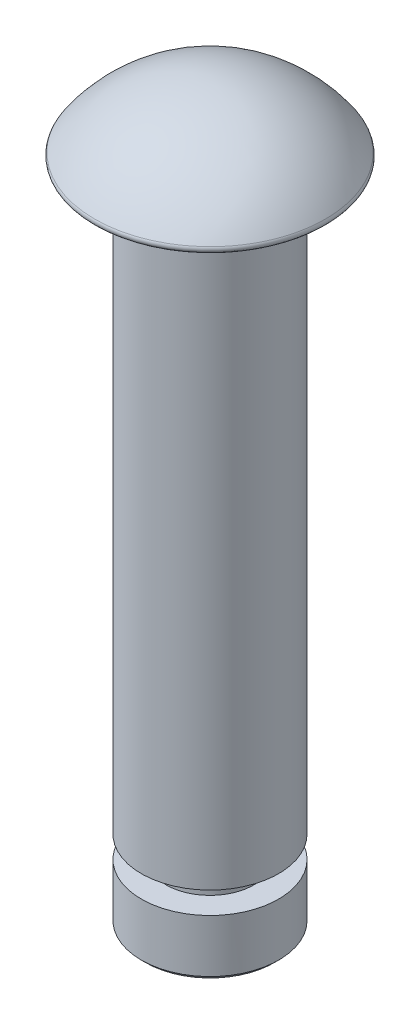
ISO-10303-21;
HEADER;
FILE_DESCRIPTION(('STEP AP214'),'2;1');
FILE_NAME('part.step','',(''),(''),'','','');
FILE_SCHEMA(('AUTOMOTIVE_DESIGN { 1 0 10303 214 1 1 1 1 }'));
ENDSEC;
DATA;
#1=APPLICATION_CONTEXT('core data for automotive mechanical design processes');
#2=APPLICATION_PROTOCOL_DEFINITION('international standard','automotive_design',2000,#1);
#3=PRODUCT_CONTEXT('',#1,'mechanical');
#4=PRODUCT('Part','Part','',(#3));
#5=PRODUCT_RELATED_PRODUCT_CATEGORY('part','',(#4));
#6=PRODUCT_DEFINITION_FORMATION('','',#4);
#7=PRODUCT_DEFINITION_CONTEXT('part definition',#1,'design');
#8=PRODUCT_DEFINITION('design','',#6,#7);
#9=PRODUCT_DEFINITION_SHAPE('','',#8);
#10=(LENGTH_UNIT() NAMED_UNIT(*) SI_UNIT(.MILLI.,.METRE.));
#11=(NAMED_UNIT(*) PLANE_ANGLE_UNIT() SI_UNIT($,.RADIAN.));
#12=(NAMED_UNIT(*) SI_UNIT($,.STERADIAN.) SOLID_ANGLE_UNIT());
#13=UNCERTAINTY_MEASURE_WITH_UNIT(LENGTH_MEASURE(1.E-05),#10,'distance_accuracy_value','');
#14=(GEOMETRIC_REPRESENTATION_CONTEXT(3) GLOBAL_UNCERTAINTY_ASSIGNED_CONTEXT((#13)) GLOBAL_UNIT_ASSIGNED_CONTEXT((#10,
#11,#12)) REPRESENTATION_CONTEXT('',''));
#15=CARTESIAN_POINT('',(0.,0.,0.));
#16=DIRECTION('',(0.,0.,1.));
#17=DIRECTION('',(1.,0.,0.));
#18=AXIS2_PLACEMENT_3D('',#15,#16,#17);
#19=CARTESIAN_POINT('',(0.,-10.541,0.));
#20=DIRECTION('',(0.,1.,0.));
#21=DIRECTION('',(-1.,0.,0.));
#22=AXIS2_PLACEMENT_3D('',#19,#20,#21);
#23=PLANE('',#22);
#24=CARTESIAN_POINT('',(0.,-10.5410000001029,0.));
#25=DIRECTION('',(0.,1.,0.));
#26=DIRECTION('',(0.,0.,1.));
#27=AXIS2_PLACEMENT_3D('',#24,#25,#26);
#28=CIRCLE('',#27,1.85620000002018);
#29=CARTESIAN_POINT('',(0.,-10.5410000001029,1.85620000002018));
#30=VERTEX_POINT('',#29);
#31=EDGE_CURVE('E133',#30,#30,#28,.T.);
#32=ORIENTED_EDGE('',*,*,#31,.F.);
#33=EDGE_LOOP('',(#32));
#34=FACE_BOUND('',#33,.T.);
#35=ADVANCED_FACE('F17',(#34),#23,.F.);
#36=CARTESIAN_POINT('',(0.,-10.4160000000206,0.));
#37=DIRECTION('',(0.,1.,0.));
#38=DIRECTION('',(0.,0.,1.));
#39=AXIS2_PLACEMENT_3D('',#36,#37,#38);
#40=CONICAL_SURFACE('',#39,1.98120000010249,0.785398163397448);
#41=CARTESIAN_POINT('',(0.,-10.416,0.));
#42=DIRECTION('',(0.,1.,0.));
#43=DIRECTION('',(-1.,0.,0.));
#44=AXIS2_PLACEMENT_3D('',#41,#42,#43);
#45=CIRCLE('',#44,1.98120000000001);
#46=CARTESIAN_POINT('',(-1.98120000000003,-10.416,0.));
#47=VERTEX_POINT('',#46);
#48=EDGE_CURVE('E89',#47,#47,#45,.T.);
#49=ORIENTED_EDGE('',*,*,#48,.F.);
#50=EDGE_LOOP('',(#49));
#51=FACE_BOUND('',#50,.T.);
#52=ORIENTED_EDGE('',*,*,#31,.T.);
#53=EDGE_LOOP('',(#52));
#54=FACE_BOUND('',#53,.T.);
#55=ADVANCED_FACE('F100',(#51,#54),#40,.T.);
#56=CARTESIAN_POINT('',(0.,10.541,0.));
#57=DIRECTION('',(0.,1.,0.));
#58=DIRECTION('',(-1.,0.,0.));
#59=AXIS2_PLACEMENT_3D('',#56,#57,#58);
#60=CYLINDRICAL_SURFACE('',#59,1.98120000000001);
#61=CARTESIAN_POINT('',(0.,-8.89,0.));
#62=DIRECTION('',(0.,1.,0.));
#63=DIRECTION('',(-1.,0.,0.));
#64=AXIS2_PLACEMENT_3D('',#61,#62,#63);
#65=CIRCLE('',#64,1.98120000000001);
#66=CARTESIAN_POINT('',(-1.98120000000003,-8.89,0.));
#67=VERTEX_POINT('',#66);
#68=EDGE_CURVE('E130',#67,#67,#65,.F.);
#69=ORIENTED_EDGE('',*,*,#68,.T.);
#70=EDGE_LOOP('',(#69));
#71=FACE_BOUND('',#70,.T.);
#72=ORIENTED_EDGE('',*,*,#48,.T.);
#73=EDGE_LOOP('',(#72));
#74=FACE_BOUND('',#73,.T.);
#75=ADVANCED_FACE('F97',(#71,#74),#60,.T.);
#76=CARTESIAN_POINT('',(1.9812,-8.89,0.));
#77=DIRECTION('',(0.,-1.,0.));
#78=DIRECTION('',(1.,0.,0.));
#79=AXIS2_PLACEMENT_3D('',#76,#77,#78);
#80=PLANE('',#79);
#81=ORIENTED_EDGE('',*,*,#68,.F.);
#82=EDGE_LOOP('',(#81));
#83=FACE_BOUND('',#82,.T.);
#84=CARTESIAN_POINT('',(0.,-8.89,0.));
#85=DIRECTION('',(0.,1.,0.));
#86=DIRECTION('',(-1.,0.,0.));
#87=AXIS2_PLACEMENT_3D('',#84,#85,#86);
#88=CIRCLE('',#87,1.27000000000001);
#89=CARTESIAN_POINT('',(-1.27000000000003,-8.89,0.));
#90=VERTEX_POINT('',#89);
#91=EDGE_CURVE('E127',#90,#90,#88,.T.);
#92=ORIENTED_EDGE('',*,*,#91,.F.);
#93=EDGE_LOOP('',(#92));
#94=FACE_BOUND('',#93,.T.);
#95=ADVANCED_FACE('F93',(#83,#94),#80,.F.);
#96=CARTESIAN_POINT('',(0.,6.51246103896104,0.));
#97=DIRECTION('',(1.,0.,0.));
#98=DIRECTION('',(0.,-1.,0.));
#99=AXIS2_PLACEMENT_3D('',#96,#97,#98);
#100=SPHERICAL_SURFACE('',#99,4.02853896103896);
#101=CARTESIAN_POINT('',(0.,8.78057648986517,0.));
#102=DIRECTION('',(0.,1.,0.));
#103=DIRECTION('',(-1.,0.,0.));
#104=AXIS2_PLACEMENT_3D('',#101,#102,#103);
#105=CIRCLE('',#104,3.32938109293287);
#106=CARTESIAN_POINT('',(-3.32938109293288,8.78057648986517,0.));
#107=VERTEX_POINT('',#106);
#108=EDGE_CURVE('E124',#107,#107,#105,.F.);
#109=ORIENTED_EDGE('',*,*,#108,.F.);
#110=EDGE_LOOP('',(#109));
#111=FACE_BOUND('',#110,.T.);
#112=ADVANCED_FACE('F90',(#111),#100,.T.);
#113=CARTESIAN_POINT('',(0.,10.541,0.));
#114=DIRECTION('',(0.,1.,0.));
#115=DIRECTION('',(-1.,0.,0.));
#116=AXIS2_PLACEMENT_3D('',#113,#114,#115);
#117=CYLINDRICAL_SURFACE('',#116,1.27000000000001);
#118=CARTESIAN_POINT('',(0.,-8.255,0.));
#119=DIRECTION('',(0.,1.,0.));
#120=DIRECTION('',(-1.,0.,0.));
#121=AXIS2_PLACEMENT_3D('',#118,#119,#120);
#122=CIRCLE('',#121,1.27000000000001);
#123=CARTESIAN_POINT('',(-1.27000000000003,-8.255,0.));
#124=VERTEX_POINT('',#123);
#125=EDGE_CURVE('E46',#124,#124,#122,.F.);
#126=ORIENTED_EDGE('',*,*,#125,.T.);
#127=EDGE_LOOP('',(#126));
#128=FACE_BOUND('',#127,.T.);
#129=ORIENTED_EDGE('',*,*,#91,.T.);
#130=EDGE_LOOP('',(#129));
#131=FACE_BOUND('',#130,.T.);
#132=ADVANCED_FACE('F76',(#128,#131),#117,.T.);
#133=CARTESIAN_POINT('',(0.,8.7102,0.));
#134=DIRECTION('',(0.,1.,0.));
#135=DIRECTION('',(-1.,0.,0.));
#136=AXIS2_PLACEMENT_3D('',#133,#134,#135);
#137=TOROIDAL_SURFACE('',#136,3.22607499594795,0.125);
#138=CARTESIAN_POINT('',(0.,8.5852,0.));
#139=DIRECTION('',(0.,1.,0.));
#140=DIRECTION('',(-1.,0.,0.));
#141=AXIS2_PLACEMENT_3D('',#138,#139,#140);
#142=CIRCLE('',#141,3.22607499594795);
#143=CARTESIAN_POINT('',(-3.22607499594796,8.5852,0.));
#144=VERTEX_POINT('',#143);
#145=CARTESIAN_POINT('',(3.22607499594794,8.5852,0.));
#146=VERTEX_POINT('',#145);
#147=EDGE_CURVE('E34',#144,#146,#142,.T.);
#148=ORIENTED_EDGE('',*,*,#147,.T.);
#149=CARTESIAN_POINT('',(0.,8.5852,0.));
#150=DIRECTION('',(0.,1.,0.));
#151=DIRECTION('',(1.,0.,0.));
#152=AXIS2_PLACEMENT_3D('',#149,#150,#151);
#153=CIRCLE('',#152,3.22607499594795);
#154=EDGE_CURVE('E36',#146,#144,#153,.T.);
#155=ORIENTED_EDGE('',*,*,#154,.T.);
#156=EDGE_LOOP('',(#148,#155));
#157=FACE_BOUND('',#156,.T.);
#158=ORIENTED_EDGE('',*,*,#108,.T.);
#159=EDGE_LOOP('',(#158));
#160=FACE_BOUND('',#159,.T.);
#161=ADVANCED_FACE('F38',(#157,#160),#137,.T.);
#162=CARTESIAN_POINT('',(1.27,-8.255,0.));
#163=DIRECTION('',(0.,1.,0.));
#164=DIRECTION('',(-1.,0.,0.));
#165=AXIS2_PLACEMENT_3D('',#162,#163,#164);
#166=PLANE('',#165);
#167=ORIENTED_EDGE('',*,*,#125,.F.);
#168=EDGE_LOOP('',(#167));
#169=FACE_BOUND('',#168,.T.);
#170=CARTESIAN_POINT('',(0.,-8.255,0.));
#171=DIRECTION('',(0.,1.,0.));
#172=DIRECTION('',(-1.,0.,0.));
#173=AXIS2_PLACEMENT_3D('',#170,#171,#172);
#174=CIRCLE('',#173,1.98120000000001);
#175=CARTESIAN_POINT('',(-1.98120000000003,-8.255,0.));
#176=VERTEX_POINT('',#175);
#177=EDGE_CURVE('E27',#176,#176,#174,.T.);
#178=ORIENTED_EDGE('',*,*,#177,.F.);
#179=EDGE_LOOP('',(#178));
#180=FACE_BOUND('',#179,.T.);
#181=ADVANCED_FACE('F62',(#169,#180),#166,.F.);
#182=CARTESIAN_POINT('',(1.9812,8.5852,0.));
#183=DIRECTION('',(0.,1.,0.));
#184=DIRECTION('',(-1.,0.,0.));
#185=AXIS2_PLACEMENT_3D('',#182,#183,#184);
#186=PLANE('',#185);
#187=CARTESIAN_POINT('',(0.,8.5852,0.));
#188=DIRECTION('',(0.,1.,0.));
#189=DIRECTION('',(-1.,0.,0.));
#190=AXIS2_PLACEMENT_3D('',#187,#188,#189);
#191=CIRCLE('',#190,1.98120000000001);
#192=CARTESIAN_POINT('',(-1.98120000000003,8.5852,0.));
#193=VERTEX_POINT('',#192);
#194=EDGE_CURVE('E11',#193,#193,#191,.F.);
#195=ORIENTED_EDGE('',*,*,#194,.F.);
#196=EDGE_LOOP('',(#195));
#197=FACE_BOUND('',#196,.T.);
#198=ORIENTED_EDGE('',*,*,#147,.F.);
#199=ORIENTED_EDGE('',*,*,#154,.F.);
#200=EDGE_LOOP('',(#198,#199));
#201=FACE_BOUND('',#200,.T.);
#202=ADVANCED_FACE('F45',(#197,#201),#186,.F.);
#203=CARTESIAN_POINT('',(0.,10.541,0.));
#204=DIRECTION('',(0.,1.,0.));
#205=DIRECTION('',(-1.,0.,0.));
#206=AXIS2_PLACEMENT_3D('',#203,#204,#205);
#207=CYLINDRICAL_SURFACE('',#206,1.98120000000001);
#208=ORIENTED_EDGE('',*,*,#194,.T.);
#209=EDGE_LOOP('',(#208));
#210=FACE_BOUND('',#209,.T.);
#211=ORIENTED_EDGE('',*,*,#177,.T.);
#212=EDGE_LOOP('',(#211));
#213=FACE_BOUND('',#212,.T.);
#214=ADVANCED_FACE('F61',(#210,#213),#207,.T.);
#215=CLOSED_SHELL('',(#35,#55,#75,#95,#112,#132,#161,#181,#202,#214));
#216=MANIFOLD_SOLID_BREP('B1',#215);
#217=ADVANCED_BREP_SHAPE_REPRESENTATION('',(#18,#216),#14);
#218=SHAPE_DEFINITION_REPRESENTATION(#9,#217);
ENDSEC;
END-ISO-10303-21;
